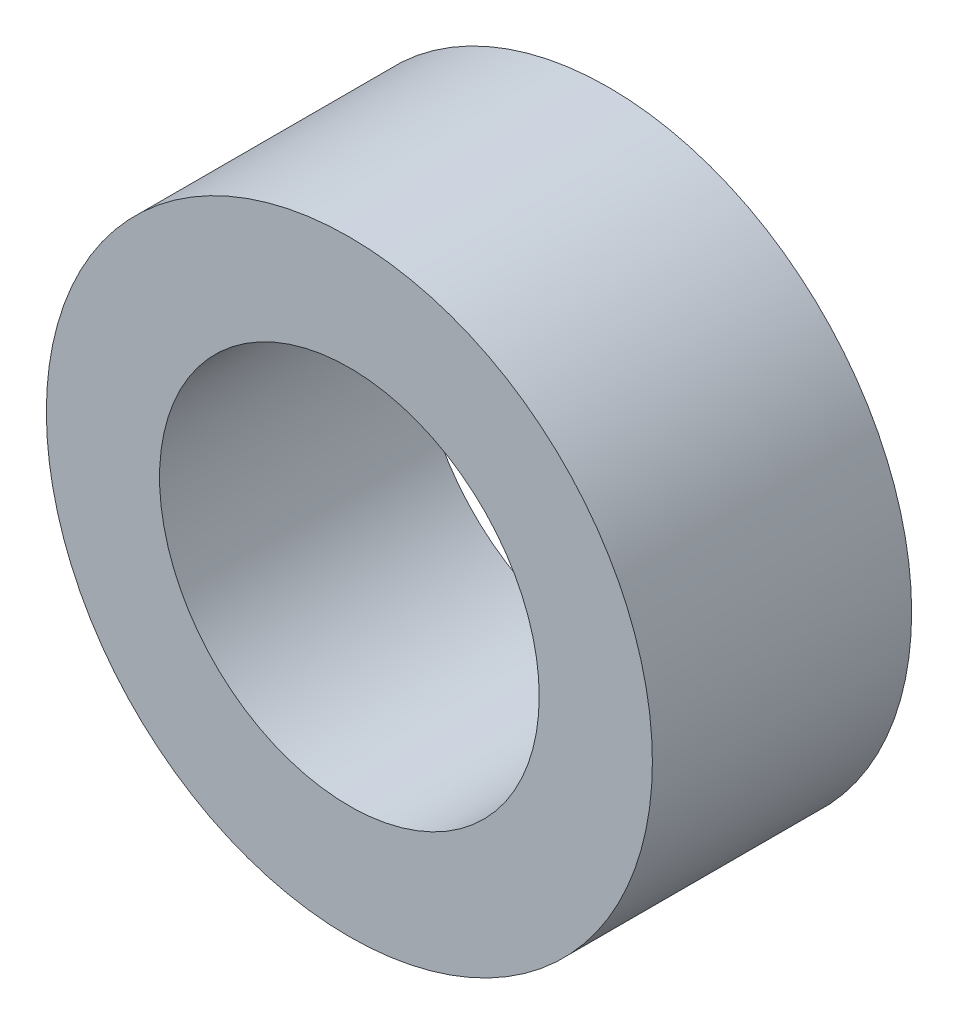
ISO-10303-21;
HEADER;
FILE_DESCRIPTION(('STEP AP214'),'2;1');
FILE_NAME('part.step','',(''),(''),'','','');
FILE_SCHEMA(('AUTOMOTIVE_DESIGN { 1 0 10303 214 1 1 1 1 }'));
ENDSEC;
DATA;
#1=APPLICATION_CONTEXT('core data for automotive mechanical design processes');
#2=APPLICATION_PROTOCOL_DEFINITION('international standard','automotive_design',2000,#1);
#3=PRODUCT_CONTEXT('',#1,'mechanical');
#4=PRODUCT('Part','Part','',(#3));
#5=PRODUCT_RELATED_PRODUCT_CATEGORY('part','',(#4));
#6=PRODUCT_DEFINITION_FORMATION('','',#4);
#7=PRODUCT_DEFINITION_CONTEXT('part definition',#1,'design');
#8=PRODUCT_DEFINITION('design','',#6,#7);
#9=PRODUCT_DEFINITION_SHAPE('','',#8);
#10=(LENGTH_UNIT() NAMED_UNIT(*) SI_UNIT(.MILLI.,.METRE.));
#11=(NAMED_UNIT(*) PLANE_ANGLE_UNIT() SI_UNIT($,.RADIAN.));
#12=(NAMED_UNIT(*) SI_UNIT($,.STERADIAN.) SOLID_ANGLE_UNIT());
#13=UNCERTAINTY_MEASURE_WITH_UNIT(LENGTH_MEASURE(1.E-05),#10,'distance_accuracy_value','');
#14=(GEOMETRIC_REPRESENTATION_CONTEXT(3) GLOBAL_UNCERTAINTY_ASSIGNED_CONTEXT((#13)) GLOBAL_UNIT_ASSIGNED_CONTEXT((#10,
#11,#12)) REPRESENTATION_CONTEXT('',''));
#15=CARTESIAN_POINT('',(0.,0.,0.));
#16=DIRECTION('',(0.,0.,1.));
#17=DIRECTION('',(1.,0.,0.));
#18=AXIS2_PLACEMENT_3D('',#15,#16,#17);
#19=CARTESIAN_POINT('',(0.,0.,-33.1558441227157));
#20=DIRECTION('',(0.,0.,1.));
#21=DIRECTION('',(1.,0.,0.));
#22=AXIS2_PLACEMENT_3D('',#19,#20,#21);
#23=CYLINDRICAL_SURFACE('',#22,9.);
#24=CARTESIAN_POINT('',(0.,0.,0.));
#25=DIRECTION('',(0.,0.,1.));
#26=DIRECTION('',(1.,0.,0.));
#27=AXIS2_PLACEMENT_3D('',#24,#25,#26);
#28=CIRCLE('',#27,9.);
#29=CARTESIAN_POINT('',(9.,0.,0.));
#30=VERTEX_POINT('',#29);
#31=EDGE_CURVE('E38',#30,#30,#28,.T.);
#32=ORIENTED_EDGE('',*,*,#31,.F.);
#33=EDGE_LOOP('',(#32));
#34=FACE_BOUND('',#33,.T.);
#35=CARTESIAN_POINT('',(0.,0.,-7.7));
#36=DIRECTION('',(0.,0.,-1.));
#37=DIRECTION('',(0.,1.,0.));
#38=AXIS2_PLACEMENT_3D('',#35,#36,#37);
#39=CIRCLE('',#38,9.);
#40=CARTESIAN_POINT('',(0.,9.,-7.7));
#41=VERTEX_POINT('',#40);
#42=EDGE_CURVE('E47',#41,#41,#39,.F.);
#43=ORIENTED_EDGE('',*,*,#42,.T.);
#44=EDGE_LOOP('',(#43));
#45=FACE_BOUND('',#44,.T.);
#46=ADVANCED_FACE('F31',(#34,#45),#23,.T.);
#47=CARTESIAN_POINT('',(0.,0.,-33.1558441227157));
#48=DIRECTION('',(0.,0.,1.));
#49=DIRECTION('',(1.,0.,0.));
#50=AXIS2_PLACEMENT_3D('',#47,#48,#49);
#51=CYLINDRICAL_SURFACE('',#50,5.63840996690553);
#52=CARTESIAN_POINT('',(0.,0.,0.));
#53=DIRECTION('',(0.,0.,1.));
#54=DIRECTION('',(1.,0.,0.));
#55=AXIS2_PLACEMENT_3D('',#52,#53,#54);
#56=CIRCLE('',#55,5.63840996690553);
#57=CARTESIAN_POINT('',(5.63840996690553,0.,0.));
#58=VERTEX_POINT('',#57);
#59=EDGE_CURVE('E42',#58,#58,#56,.T.);
#60=ORIENTED_EDGE('',*,*,#59,.T.);
#61=EDGE_LOOP('',(#60));
#62=FACE_BOUND('',#61,.T.);
#63=CARTESIAN_POINT('',(0.,0.,-7.7));
#64=DIRECTION('',(0.,0.,-1.));
#65=DIRECTION('',(0.,1.,0.));
#66=AXIS2_PLACEMENT_3D('',#63,#64,#65);
#67=CIRCLE('',#66,5.63840996690553);
#68=CARTESIAN_POINT('',(0.,5.63840996690553,-7.7));
#69=VERTEX_POINT('',#68);
#70=EDGE_CURVE('E10',#69,#69,#67,.F.);
#71=ORIENTED_EDGE('',*,*,#70,.F.);
#72=EDGE_LOOP('',(#71));
#73=FACE_BOUND('',#72,.T.);
#74=ADVANCED_FACE('F58',(#62,#73),#51,.F.);
#75=CARTESIAN_POINT('',(0.,0.,0.));
#76=DIRECTION('',(0.,0.,1.));
#77=DIRECTION('',(1.,0.,0.));
#78=AXIS2_PLACEMENT_3D('',#75,#76,#77);
#79=PLANE('',#78);
#80=ORIENTED_EDGE('',*,*,#59,.F.);
#81=EDGE_LOOP('',(#80));
#82=FACE_BOUND('',#81,.T.);
#83=ORIENTED_EDGE('',*,*,#31,.T.);
#84=EDGE_LOOP('',(#83));
#85=FACE_BOUND('',#84,.T.);
#86=ADVANCED_FACE('F54',(#82,#85),#79,.T.);
#87=CARTESIAN_POINT('',(0.,0.,-7.7));
#88=DIRECTION('',(0.,0.,-1.));
#89=DIRECTION('',(0.,-1.,0.));
#90=AXIS2_PLACEMENT_3D('',#87,#88,#89);
#91=PLANE('',#90);
#92=ORIENTED_EDGE('',*,*,#42,.F.);
#93=EDGE_LOOP('',(#92));
#94=FACE_BOUND('',#93,.T.);
#95=ORIENTED_EDGE('',*,*,#70,.T.);
#96=EDGE_LOOP('',(#95));
#97=FACE_BOUND('',#96,.T.);
#98=ADVANCED_FACE('F33',(#94,#97),#91,.T.);
#99=CLOSED_SHELL('',(#46,#74,#86,#98));
#100=MANIFOLD_SOLID_BREP('B2',#99);
#101=ADVANCED_BREP_SHAPE_REPRESENTATION('',(#18,#100),#14);
#102=SHAPE_DEFINITION_REPRESENTATION(#9,#101);
ENDSEC;
END-ISO-10303-21;
